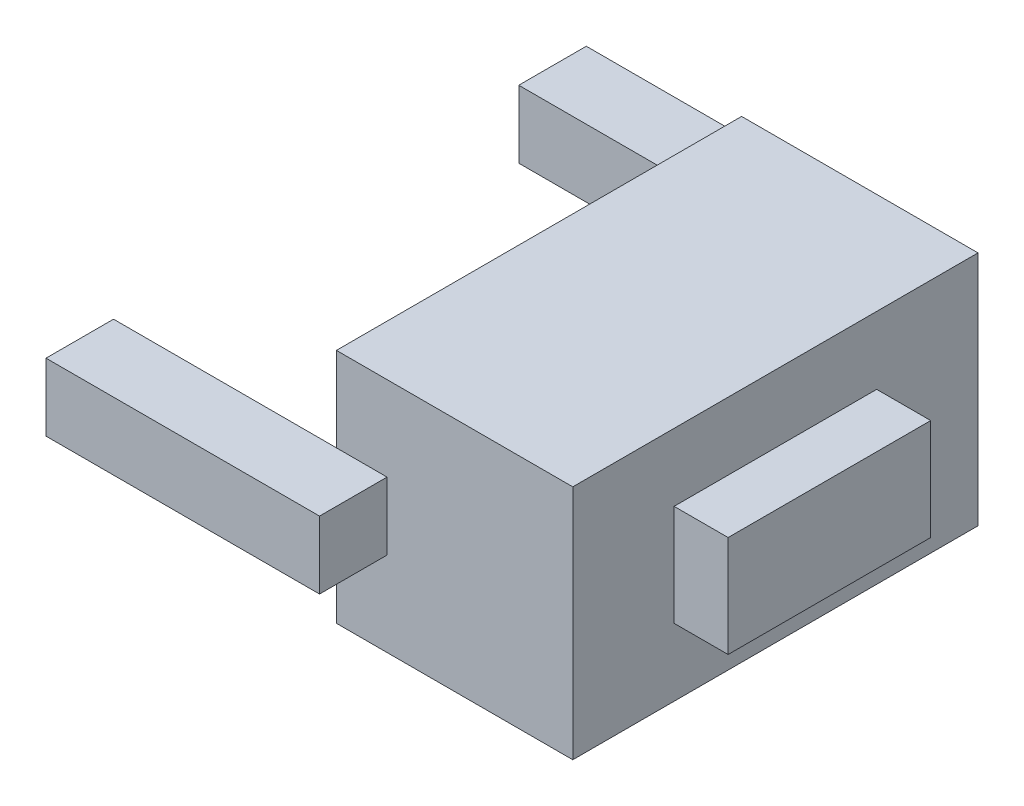
ISO-10303-21;
HEADER;
FILE_DESCRIPTION(('STEP AP214'),'2;1');
FILE_NAME('part.step','',(''),(''),'','','');
FILE_SCHEMA(('AUTOMOTIVE_DESIGN { 1 0 10303 214 1 1 1 1 }'));
ENDSEC;
DATA;
#1=APPLICATION_CONTEXT('core data for automotive mechanical design processes');
#2=APPLICATION_PROTOCOL_DEFINITION('international standard','automotive_design',2000,#1);
#3=PRODUCT_CONTEXT('',#1,'mechanical');
#4=PRODUCT('Part','Part','',(#3));
#5=PRODUCT_RELATED_PRODUCT_CATEGORY('part','',(#4));
#6=PRODUCT_DEFINITION_FORMATION('','',#4);
#7=PRODUCT_DEFINITION_CONTEXT('part definition',#1,'design');
#8=PRODUCT_DEFINITION('design','',#6,#7);
#9=PRODUCT_DEFINITION_SHAPE('','',#8);
#10=(LENGTH_UNIT() NAMED_UNIT(*) SI_UNIT(.MILLI.,.METRE.));
#11=(NAMED_UNIT(*) PLANE_ANGLE_UNIT() SI_UNIT($,.RADIAN.));
#12=(NAMED_UNIT(*) SI_UNIT($,.STERADIAN.) SOLID_ANGLE_UNIT());
#13=UNCERTAINTY_MEASURE_WITH_UNIT(LENGTH_MEASURE(1.E-05),#10,'distance_accuracy_value','');
#14=(GEOMETRIC_REPRESENTATION_CONTEXT(3) GLOBAL_UNCERTAINTY_ASSIGNED_CONTEXT((#13)) GLOBAL_UNIT_ASSIGNED_CONTEXT((#10,
#11,#12)) REPRESENTATION_CONTEXT('',''));
#15=CARTESIAN_POINT('',(0.,0.,0.));
#16=DIRECTION('',(0.,0.,1.));
#17=DIRECTION('',(1.,0.,0.));
#18=AXIS2_PLACEMENT_3D('',#15,#16,#17);
#19=CARTESIAN_POINT('',(0.,0.,0.));
#20=DIRECTION('',(-1.,0.,0.));
#21=DIRECTION('',(0.,0.,1.));
#22=AXIS2_PLACEMENT_3D('',#19,#20,#21);
#23=PLANE('',#22);
#24=DIRECTION('',(0.,1.,0.));
#25=VECTOR('',#24,1.);
#26=CARTESIAN_POINT('',(0.,0.,-6.));
#27=LINE('',#26,#25);
#28=CARTESIAN_POINT('',(0.,2.25,-6.));
#29=VERTEX_POINT('',#28);
#30=CARTESIAN_POINT('',(0.,3.5,-6.));
#31=VERTEX_POINT('',#30);
#32=EDGE_CURVE('E225',#29,#31,#27,.T.);
#33=ORIENTED_EDGE('',*,*,#32,.F.);
#34=DIRECTION('',(0.,1.,0.));
#35=VECTOR('',#34,1.);
#36=CARTESIAN_POINT('',(0.,2.25,-6.));
#37=LINE('',#36,#35);
#38=CARTESIAN_POINT('',(0.,1.25,-6.));
#39=VERTEX_POINT('',#38);
#40=EDGE_CURVE('E188',#39,#29,#37,.T.);
#41=ORIENTED_EDGE('',*,*,#40,.F.);
#42=CARTESIAN_POINT('',(0.,0.,-6.));
#43=VERTEX_POINT('',#42);
#44=EDGE_CURVE('E233',#43,#39,#27,.T.);
#45=ORIENTED_EDGE('',*,*,#44,.F.);
#46=DIRECTION('',(0.,0.,-1.));
#47=VECTOR('',#46,1.);
#48=CARTESIAN_POINT('',(0.,0.,0.));
#49=LINE('',#48,#47);
#50=CARTESIAN_POINT('',(0.,0.,0.));
#51=VERTEX_POINT('',#50);
#52=EDGE_CURVE('E234',#51,#43,#49,.T.);
#53=ORIENTED_EDGE('',*,*,#52,.F.);
#54=DIRECTION('',(0.,-1.,0.));
#55=VECTOR('',#54,1.);
#56=CARTESIAN_POINT('',(0.,0.,0.));
#57=LINE('',#56,#55);
#58=CARTESIAN_POINT('',(0.,1.25,0.));
#59=VERTEX_POINT('',#58);
#60=EDGE_CURVE('E256',#59,#51,#57,.T.);
#61=ORIENTED_EDGE('',*,*,#60,.F.);
#62=DIRECTION('',(0.,-1.,0.));
#63=VECTOR('',#62,1.);
#64=CARTESIAN_POINT('',(0.,2.25,0.));
#65=LINE('',#64,#63);
#66=CARTESIAN_POINT('',(0.,2.25,0.));
#67=VERTEX_POINT('',#66);
#68=EDGE_CURVE('E324',#67,#59,#65,.T.);
#69=ORIENTED_EDGE('',*,*,#68,.F.);
#70=CARTESIAN_POINT('',(0.,3.5,0.));
#71=VERTEX_POINT('',#70);
#72=EDGE_CURVE('E237',#71,#67,#57,.T.);
#73=ORIENTED_EDGE('',*,*,#72,.F.);
#74=DIRECTION('',(0.,0.,1.));
#75=VECTOR('',#74,1.);
#76=CARTESIAN_POINT('',(0.,3.5,0.));
#77=LINE('',#76,#75);
#78=EDGE_CURVE('E232',#31,#71,#77,.T.);
#79=ORIENTED_EDGE('',*,*,#78,.F.);
#80=EDGE_LOOP('',(#33,#41,#45,#53,#61,#69,#73,#79));
#81=FACE_BOUND('',#80,.T.);
#82=ADVANCED_FACE('F35',(#81),#23,.T.);
#83=CARTESIAN_POINT('',(3.5,0.,-6.));
#84=DIRECTION('',(0.,0.,1.));
#85=DIRECTION('',(1.,0.,0.));
#86=AXIS2_PLACEMENT_3D('',#83,#84,#85);
#87=PLANE('',#86);
#88=DIRECTION('',(-1.,0.,0.));
#89=VECTOR('',#88,1.);
#90=CARTESIAN_POINT('',(0.,1.25,-6.));
#91=LINE('',#90,#89);
#92=CARTESIAN_POINT('',(0.75,1.25,-6.));
#93=VERTEX_POINT('',#92);
#94=EDGE_CURVE('E52',#93,#39,#91,.T.);
#95=ORIENTED_EDGE('',*,*,#94,.F.);
#96=DIRECTION('',(0.,-1.,0.));
#97=VECTOR('',#96,1.);
#98=CARTESIAN_POINT('',(0.75,2.25,-6.));
#99=LINE('',#98,#97);
#100=CARTESIAN_POINT('',(0.75,2.25,-6.));
#101=VERTEX_POINT('',#100);
#102=EDGE_CURVE('E198',#101,#93,#99,.T.);
#103=ORIENTED_EDGE('',*,*,#102,.F.);
#104=DIRECTION('',(1.,0.,0.));
#105=VECTOR('',#104,1.);
#106=CARTESIAN_POINT('',(0.,2.25,-6.));
#107=LINE('',#106,#105);
#108=EDGE_CURVE('E200',#29,#101,#107,.T.);
#109=ORIENTED_EDGE('',*,*,#108,.F.);
#110=ORIENTED_EDGE('',*,*,#32,.T.);
#111=DIRECTION('',(-1.,0.,0.));
#112=VECTOR('',#111,1.);
#113=CARTESIAN_POINT('',(3.5,3.5,-6.));
#114=LINE('',#113,#112);
#115=CARTESIAN_POINT('',(3.5,3.5,-6.));
#116=VERTEX_POINT('',#115);
#117=EDGE_CURVE('E250',#116,#31,#114,.T.);
#118=ORIENTED_EDGE('',*,*,#117,.F.);
#119=DIRECTION('',(0.,1.,0.));
#120=VECTOR('',#119,1.);
#121=CARTESIAN_POINT('',(3.5,0.,-6.));
#122=LINE('',#121,#120);
#123=CARTESIAN_POINT('',(3.5,0.,-6.));
#124=VERTEX_POINT('',#123);
#125=EDGE_CURVE('E262',#124,#116,#122,.T.);
#126=ORIENTED_EDGE('',*,*,#125,.F.);
#127=DIRECTION('',(-1.,0.,0.));
#128=VECTOR('',#127,1.);
#129=CARTESIAN_POINT('',(3.5,0.,-6.));
#130=LINE('',#129,#128);
#131=EDGE_CURVE('E44',#124,#43,#130,.T.);
#132=ORIENTED_EDGE('',*,*,#131,.T.);
#133=ORIENTED_EDGE('',*,*,#44,.T.);
#134=EDGE_LOOP('',(#95,#103,#109,#110,#118,#126,#132,#133));
#135=FACE_BOUND('',#134,.T.);
#136=ADVANCED_FACE('F223',(#135),#87,.F.);
#137=CARTESIAN_POINT('',(3.5,0.,0.));
#138=DIRECTION('',(0.,0.,-1.));
#139=DIRECTION('',(-1.,0.,0.));
#140=AXIS2_PLACEMENT_3D('',#137,#138,#139);
#141=PLANE('',#140);
#142=DIRECTION('',(-1.,0.,0.));
#143=VECTOR('',#142,1.);
#144=CARTESIAN_POINT('',(0.,2.25,0.));
#145=LINE('',#144,#143);
#146=CARTESIAN_POINT('',(0.75,2.25,0.));
#147=VERTEX_POINT('',#146);
#148=EDGE_CURVE('E60',#147,#67,#145,.T.);
#149=ORIENTED_EDGE('',*,*,#148,.F.);
#150=DIRECTION('',(0.,1.,0.));
#151=VECTOR('',#150,1.);
#152=CARTESIAN_POINT('',(0.75,2.25,0.));
#153=LINE('',#152,#151);
#154=CARTESIAN_POINT('',(0.75,1.25,0.));
#155=VERTEX_POINT('',#154);
#156=EDGE_CURVE('E310',#155,#147,#153,.T.);
#157=ORIENTED_EDGE('',*,*,#156,.F.);
#158=DIRECTION('',(1.,0.,0.));
#159=VECTOR('',#158,1.);
#160=CARTESIAN_POINT('',(0.,1.25,0.));
#161=LINE('',#160,#159);
#162=EDGE_CURVE('E320',#59,#155,#161,.T.);
#163=ORIENTED_EDGE('',*,*,#162,.F.);
#164=ORIENTED_EDGE('',*,*,#60,.T.);
#165=DIRECTION('',(-1.,0.,0.));
#166=VECTOR('',#165,1.);
#167=CARTESIAN_POINT('',(3.5,0.,0.));
#168=LINE('',#167,#166);
#169=CARTESIAN_POINT('',(3.5,0.,0.));
#170=VERTEX_POINT('',#169);
#171=EDGE_CURVE('E11',#170,#51,#168,.T.);
#172=ORIENTED_EDGE('',*,*,#171,.F.);
#173=DIRECTION('',(0.,-1.,0.));
#174=VECTOR('',#173,1.);
#175=CARTESIAN_POINT('',(3.5,0.,0.));
#176=LINE('',#175,#174);
#177=CARTESIAN_POINT('',(3.5,3.5,0.));
#178=VERTEX_POINT('',#177);
#179=EDGE_CURVE('E246',#178,#170,#176,.T.);
#180=ORIENTED_EDGE('',*,*,#179,.F.);
#181=DIRECTION('',(-1.,0.,0.));
#182=VECTOR('',#181,1.);
#183=CARTESIAN_POINT('',(3.5,3.5,0.));
#184=LINE('',#183,#182);
#185=EDGE_CURVE('E247',#178,#71,#184,.T.);
#186=ORIENTED_EDGE('',*,*,#185,.T.);
#187=ORIENTED_EDGE('',*,*,#72,.T.);
#188=EDGE_LOOP('',(#149,#157,#163,#164,#172,#180,#186,#187));
#189=FACE_BOUND('',#188,.T.);
#190=ADVANCED_FACE('F37',(#189),#141,.F.);
#191=CARTESIAN_POINT('',(3.5,0.,0.));
#192=DIRECTION('',(-1.,0.,0.));
#193=DIRECTION('',(0.,0.,1.));
#194=AXIS2_PLACEMENT_3D('',#191,#192,#193);
#195=PLANE('',#194);
#196=ORIENTED_EDGE('',*,*,#179,.T.);
#197=DIRECTION('',(0.,0.,-1.));
#198=VECTOR('',#197,1.);
#199=CARTESIAN_POINT('',(3.5,0.,0.));
#200=LINE('',#199,#198);
#201=EDGE_CURVE('E264',#170,#124,#200,.T.);
#202=ORIENTED_EDGE('',*,*,#201,.T.);
#203=ORIENTED_EDGE('',*,*,#125,.T.);
#204=DIRECTION('',(0.,0.,1.));
#205=VECTOR('',#204,1.);
#206=CARTESIAN_POINT('',(3.5,3.5,0.));
#207=LINE('',#206,#205);
#208=EDGE_CURVE('E251',#116,#178,#207,.T.);
#209=ORIENTED_EDGE('',*,*,#208,.T.);
#210=EDGE_LOOP('',(#196,#202,#203,#209));
#211=FACE_BOUND('',#210,.T.);
#212=DIRECTION('',(0.,-1.,0.));
#213=VECTOR('',#212,1.);
#214=CARTESIAN_POINT('',(3.5,1.,-1.5));
#215=LINE('',#214,#213);
#216=CARTESIAN_POINT('',(3.5,2.5,-1.5));
#217=VERTEX_POINT('',#216);
#218=CARTESIAN_POINT('',(3.5,1.,-1.5));
#219=VERTEX_POINT('',#218);
#220=EDGE_CURVE('E291',#217,#219,#215,.T.);
#221=ORIENTED_EDGE('',*,*,#220,.F.);
#222=DIRECTION('',(0.,0.,1.));
#223=VECTOR('',#222,1.);
#224=CARTESIAN_POINT('',(3.5,2.5,-1.5));
#225=LINE('',#224,#223);
#226=CARTESIAN_POINT('',(3.5,2.5,-4.5));
#227=VERTEX_POINT('',#226);
#228=EDGE_CURVE('E281',#227,#217,#225,.T.);
#229=ORIENTED_EDGE('',*,*,#228,.F.);
#230=DIRECTION('',(0.,1.,0.));
#231=VECTOR('',#230,1.);
#232=CARTESIAN_POINT('',(3.5,1.,-4.5));
#233=LINE('',#232,#231);
#234=CARTESIAN_POINT('',(3.5,1.,-4.5));
#235=VERTEX_POINT('',#234);
#236=EDGE_CURVE('E285',#235,#227,#233,.T.);
#237=ORIENTED_EDGE('',*,*,#236,.F.);
#238=DIRECTION('',(0.,0.,-1.));
#239=VECTOR('',#238,1.);
#240=CARTESIAN_POINT('',(3.5,1.,-1.5));
#241=LINE('',#240,#239);
#242=EDGE_CURVE('E288',#219,#235,#241,.T.);
#243=ORIENTED_EDGE('',*,*,#242,.F.);
#244=EDGE_LOOP('',(#221,#229,#237,#243));
#245=FACE_BOUND('',#244,.T.);
#246=ADVANCED_FACE('F379',(#211,#245),#195,.F.);
#247=CARTESIAN_POINT('',(3.5,0.,0.));
#248=DIRECTION('',(0.,1.,0.));
#249=DIRECTION('',(0.,0.,1.));
#250=AXIS2_PLACEMENT_3D('',#247,#248,#249);
#251=PLANE('',#250);
#252=ORIENTED_EDGE('',*,*,#52,.T.);
#253=ORIENTED_EDGE('',*,*,#131,.F.);
#254=ORIENTED_EDGE('',*,*,#201,.F.);
#255=ORIENTED_EDGE('',*,*,#171,.T.);
#256=EDGE_LOOP('',(#252,#253,#254,#255));
#257=FACE_BOUND('',#256,.T.);
#258=ADVANCED_FACE('F384',(#257),#251,.F.);
#259=CARTESIAN_POINT('',(3.5,3.5,0.));
#260=DIRECTION('',(0.,-1.,0.));
#261=DIRECTION('',(0.,0.,-1.));
#262=AXIS2_PLACEMENT_3D('',#259,#260,#261);
#263=PLANE('',#262);
#264=ORIENTED_EDGE('',*,*,#78,.T.);
#265=ORIENTED_EDGE('',*,*,#185,.F.);
#266=ORIENTED_EDGE('',*,*,#208,.F.);
#267=ORIENTED_EDGE('',*,*,#117,.T.);
#268=EDGE_LOOP('',(#264,#265,#266,#267));
#269=FACE_BOUND('',#268,.T.);
#270=ADVANCED_FACE('F381',(#269),#263,.F.);
#271=CARTESIAN_POINT('',(4.3,1.,-1.5));
#272=DIRECTION('',(0.,0.,-1.));
#273=DIRECTION('',(-1.,0.,0.));
#274=AXIS2_PLACEMENT_3D('',#271,#272,#273);
#275=PLANE('',#274);
#276=ORIENTED_EDGE('',*,*,#220,.T.);
#277=DIRECTION('',(-1.,0.,0.));
#278=VECTOR('',#277,1.);
#279=CARTESIAN_POINT('',(4.3,1.,-1.5));
#280=LINE('',#279,#278);
#281=CARTESIAN_POINT('',(4.3,1.,-1.5));
#282=VERTEX_POINT('',#281);
#283=EDGE_CURVE('E268',#282,#219,#280,.T.);
#284=ORIENTED_EDGE('',*,*,#283,.F.);
#285=DIRECTION('',(0.,-1.,0.));
#286=VECTOR('',#285,1.);
#287=CARTESIAN_POINT('',(4.3,1.,-1.5));
#288=LINE('',#287,#286);
#289=CARTESIAN_POINT('',(4.3,2.5,-1.5));
#290=VERTEX_POINT('',#289);
#291=EDGE_CURVE('E284',#290,#282,#288,.T.);
#292=ORIENTED_EDGE('',*,*,#291,.F.);
#293=DIRECTION('',(-1.,0.,0.));
#294=VECTOR('',#293,1.);
#295=CARTESIAN_POINT('',(4.3,2.5,-1.5));
#296=LINE('',#295,#294);
#297=EDGE_CURVE('E277',#290,#217,#296,.T.);
#298=ORIENTED_EDGE('',*,*,#297,.T.);
#299=EDGE_LOOP('',(#276,#284,#292,#298));
#300=FACE_BOUND('',#299,.T.);
#301=ADVANCED_FACE('F383',(#300),#275,.F.);
#302=CARTESIAN_POINT('',(4.3,1.,-1.5));
#303=DIRECTION('',(0.,1.,0.));
#304=DIRECTION('',(0.,0.,1.));
#305=AXIS2_PLACEMENT_3D('',#302,#303,#304);
#306=PLANE('',#305);
#307=ORIENTED_EDGE('',*,*,#242,.T.);
#308=DIRECTION('',(-1.,0.,0.));
#309=VECTOR('',#308,1.);
#310=CARTESIAN_POINT('',(4.3,1.,-4.5));
#311=LINE('',#310,#309);
#312=CARTESIAN_POINT('',(4.3,1.,-4.5));
#313=VERTEX_POINT('',#312);
#314=EDGE_CURVE('E271',#313,#235,#311,.T.);
#315=ORIENTED_EDGE('',*,*,#314,.F.);
#316=DIRECTION('',(0.,0.,-1.));
#317=VECTOR('',#316,1.);
#318=CARTESIAN_POINT('',(4.3,1.,-1.5));
#319=LINE('',#318,#317);
#320=EDGE_CURVE('E298',#282,#313,#319,.T.);
#321=ORIENTED_EDGE('',*,*,#320,.F.);
#322=ORIENTED_EDGE('',*,*,#283,.T.);
#323=EDGE_LOOP('',(#307,#315,#321,#322));
#324=FACE_BOUND('',#323,.T.);
#325=ADVANCED_FACE('F426',(#324),#306,.F.);
#326=CARTESIAN_POINT('',(4.3,1.,-4.5));
#327=DIRECTION('',(0.,0.,1.));
#328=DIRECTION('',(1.,0.,0.));
#329=AXIS2_PLACEMENT_3D('',#326,#327,#328);
#330=PLANE('',#329);
#331=ORIENTED_EDGE('',*,*,#236,.T.);
#332=DIRECTION('',(-1.,0.,0.));
#333=VECTOR('',#332,1.);
#334=CARTESIAN_POINT('',(4.3,2.5,-4.5));
#335=LINE('',#334,#333);
#336=CARTESIAN_POINT('',(4.3,2.5,-4.5));
#337=VERTEX_POINT('',#336);
#338=EDGE_CURVE('E274',#337,#227,#335,.T.);
#339=ORIENTED_EDGE('',*,*,#338,.F.);
#340=DIRECTION('',(0.,1.,0.));
#341=VECTOR('',#340,1.);
#342=CARTESIAN_POINT('',(4.3,1.,-4.5));
#343=LINE('',#342,#341);
#344=EDGE_CURVE('E296',#313,#337,#343,.T.);
#345=ORIENTED_EDGE('',*,*,#344,.F.);
#346=ORIENTED_EDGE('',*,*,#314,.T.);
#347=EDGE_LOOP('',(#331,#339,#345,#346));
#348=FACE_BOUND('',#347,.T.);
#349=ADVANCED_FACE('F422',(#348),#330,.F.);
#350=CARTESIAN_POINT('',(4.3,2.5,-1.5));
#351=DIRECTION('',(0.,-1.,0.));
#352=DIRECTION('',(0.,0.,-1.));
#353=AXIS2_PLACEMENT_3D('',#350,#351,#352);
#354=PLANE('',#353);
#355=ORIENTED_EDGE('',*,*,#228,.T.);
#356=ORIENTED_EDGE('',*,*,#297,.F.);
#357=DIRECTION('',(0.,0.,1.));
#358=VECTOR('',#357,1.);
#359=CARTESIAN_POINT('',(4.3,2.5,-1.5));
#360=LINE('',#359,#358);
#361=EDGE_CURVE('E280',#337,#290,#360,.T.);
#362=ORIENTED_EDGE('',*,*,#361,.F.);
#363=ORIENTED_EDGE('',*,*,#338,.T.);
#364=EDGE_LOOP('',(#355,#356,#362,#363));
#365=FACE_BOUND('',#364,.T.);
#366=ADVANCED_FACE('F415',(#365),#354,.F.);
#367=CARTESIAN_POINT('',(4.3,0.,0.));
#368=DIRECTION('',(-1.,0.,0.));
#369=DIRECTION('',(0.,0.,1.));
#370=AXIS2_PLACEMENT_3D('',#367,#368,#369);
#371=PLANE('',#370);
#372=ORIENTED_EDGE('',*,*,#291,.T.);
#373=ORIENTED_EDGE('',*,*,#320,.T.);
#374=ORIENTED_EDGE('',*,*,#344,.T.);
#375=ORIENTED_EDGE('',*,*,#361,.T.);
#376=EDGE_LOOP('',(#372,#373,#374,#375));
#377=FACE_BOUND('',#376,.T.);
#378=ADVANCED_FACE('F408',(#377),#371,.F.);
#379=CARTESIAN_POINT('',(0.,1.25,1.));
#380=DIRECTION('',(0.,1.,0.));
#381=DIRECTION('',(0.,0.,1.));
#382=AXIS2_PLACEMENT_3D('',#379,#380,#381);
#383=PLANE('',#382);
#384=ORIENTED_EDGE('',*,*,#162,.T.);
#385=DIRECTION('',(0.,0.,-1.));
#386=VECTOR('',#385,1.);
#387=CARTESIAN_POINT('',(0.75,1.25,1.));
#388=LINE('',#387,#386);
#389=CARTESIAN_POINT('',(0.75,1.25,1.));
#390=VERTEX_POINT('',#389);
#391=EDGE_CURVE('E294',#390,#155,#388,.T.);
#392=ORIENTED_EDGE('',*,*,#391,.F.);
#393=DIRECTION('',(1.,0.,0.));
#394=VECTOR('',#393,1.);
#395=CARTESIAN_POINT('',(0.,1.25,1.));
#396=LINE('',#395,#394);
#397=CARTESIAN_POINT('',(-3.3,1.25,1.));
#398=VERTEX_POINT('',#397);
#399=EDGE_CURVE('E315',#398,#390,#396,.T.);
#400=ORIENTED_EDGE('',*,*,#399,.F.);
#401=DIRECTION('',(0.,0.,1.));
#402=VECTOR('',#401,1.);
#403=CARTESIAN_POINT('',(-3.3,1.25,0.));
#404=LINE('',#403,#402);
#405=CARTESIAN_POINT('',(-3.3,1.25,0.));
#406=VERTEX_POINT('',#405);
#407=EDGE_CURVE('E352',#406,#398,#404,.T.);
#408=ORIENTED_EDGE('',*,*,#407,.F.);
#409=DIRECTION('',(1.,0.,0.));
#410=VECTOR('',#409,1.);
#411=CARTESIAN_POINT('',(-3.3,1.25,0.));
#412=LINE('',#411,#410);
#413=EDGE_CURVE('E317',#406,#59,#412,.T.);
#414=ORIENTED_EDGE('',*,*,#413,.T.);
#415=EDGE_LOOP('',(#384,#392,#400,#408,#414));
#416=FACE_BOUND('',#415,.T.);
#417=ADVANCED_FACE('F406',(#416),#383,.F.);
#418=CARTESIAN_POINT('',(0.75,2.25,1.));
#419=DIRECTION('',(-1.,0.,0.));
#420=DIRECTION('',(0.,-1.,0.));
#421=AXIS2_PLACEMENT_3D('',#418,#419,#420);
#422=PLANE('',#421);
#423=ORIENTED_EDGE('',*,*,#156,.T.);
#424=DIRECTION('',(0.,0.,-1.));
#425=VECTOR('',#424,1.);
#426=CARTESIAN_POINT('',(0.75,2.25,1.));
#427=LINE('',#426,#425);
#428=CARTESIAN_POINT('',(0.75,2.25,1.));
#429=VERTEX_POINT('',#428);
#430=EDGE_CURVE('E304',#429,#147,#427,.T.);
#431=ORIENTED_EDGE('',*,*,#430,.F.);
#432=DIRECTION('',(0.,1.,0.));
#433=VECTOR('',#432,1.);
#434=CARTESIAN_POINT('',(0.75,2.25,1.));
#435=LINE('',#434,#433);
#436=EDGE_CURVE('E336',#390,#429,#435,.T.);
#437=ORIENTED_EDGE('',*,*,#436,.F.);
#438=ORIENTED_EDGE('',*,*,#391,.T.);
#439=EDGE_LOOP('',(#423,#431,#437,#438));
#440=FACE_BOUND('',#439,.T.);
#441=ADVANCED_FACE('F403',(#440),#422,.F.);
#442=CARTESIAN_POINT('',(0.,2.25,1.));
#443=DIRECTION('',(0.,-1.,0.));
#444=DIRECTION('',(0.,0.,-1.));
#445=AXIS2_PLACEMENT_3D('',#442,#443,#444);
#446=PLANE('',#445);
#447=ORIENTED_EDGE('',*,*,#148,.T.);
#448=DIRECTION('',(1.,0.,0.));
#449=VECTOR('',#448,1.);
#450=CARTESIAN_POINT('',(-3.3,2.25,0.));
#451=LINE('',#450,#449);
#452=CARTESIAN_POINT('',(-3.3,2.25,0.));
#453=VERTEX_POINT('',#452);
#454=EDGE_CURVE('E321',#453,#67,#451,.T.);
#455=ORIENTED_EDGE('',*,*,#454,.F.);
#456=DIRECTION('',(0.,0.,-1.));
#457=VECTOR('',#456,1.);
#458=CARTESIAN_POINT('',(-3.3,2.25,0.));
#459=LINE('',#458,#457);
#460=CARTESIAN_POINT('',(-3.3,2.25,1.));
#461=VERTEX_POINT('',#460);
#462=EDGE_CURVE('E333',#461,#453,#459,.T.);
#463=ORIENTED_EDGE('',*,*,#462,.F.);
#464=DIRECTION('',(-1.,0.,0.));
#465=VECTOR('',#464,1.);
#466=CARTESIAN_POINT('',(0.,2.25,1.));
#467=LINE('',#466,#465);
#468=EDGE_CURVE('E307',#429,#461,#467,.T.);
#469=ORIENTED_EDGE('',*,*,#468,.F.);
#470=ORIENTED_EDGE('',*,*,#430,.T.);
#471=EDGE_LOOP('',(#447,#455,#463,#469,#470));
#472=FACE_BOUND('',#471,.T.);
#473=ADVANCED_FACE('F353',(#472),#446,.F.);
#474=CARTESIAN_POINT('',(0.,0.,1.));
#475=DIRECTION('',(0.,0.,1.));
#476=DIRECTION('',(1.,0.,0.));
#477=AXIS2_PLACEMENT_3D('',#474,#475,#476);
#478=PLANE('',#477);
#479=ORIENTED_EDGE('',*,*,#468,.T.);
#480=DIRECTION('',(0.,1.,0.));
#481=VECTOR('',#480,1.);
#482=CARTESIAN_POINT('',(-3.3,2.25,1.));
#483=LINE('',#482,#481);
#484=EDGE_CURVE('E342',#398,#461,#483,.T.);
#485=ORIENTED_EDGE('',*,*,#484,.F.);
#486=ORIENTED_EDGE('',*,*,#399,.T.);
#487=ORIENTED_EDGE('',*,*,#436,.T.);
#488=EDGE_LOOP('',(#479,#485,#486,#487));
#489=FACE_BOUND('',#488,.T.);
#490=ADVANCED_FACE('F341',(#489),#478,.T.);
#491=CARTESIAN_POINT('',(-3.3,2.25,0.));
#492=DIRECTION('',(0.,0.,1.));
#493=DIRECTION('',(1.,0.,0.));
#494=AXIS2_PLACEMENT_3D('',#491,#492,#493);
#495=PLANE('',#494);
#496=ORIENTED_EDGE('',*,*,#68,.T.);
#497=ORIENTED_EDGE('',*,*,#413,.F.);
#498=DIRECTION('',(0.,-1.,0.));
#499=VECTOR('',#498,1.);
#500=CARTESIAN_POINT('',(-3.3,2.25,0.));
#501=LINE('',#500,#499);
#502=EDGE_CURVE('E328',#453,#406,#501,.T.);
#503=ORIENTED_EDGE('',*,*,#502,.F.);
#504=ORIENTED_EDGE('',*,*,#454,.T.);
#505=EDGE_LOOP('',(#496,#497,#503,#504));
#506=FACE_BOUND('',#505,.T.);
#507=ADVANCED_FACE('F357',(#506),#495,.F.);
#508=CARTESIAN_POINT('',(-3.3,0.,0.));
#509=DIRECTION('',(-1.,0.,0.));
#510=DIRECTION('',(0.,0.,1.));
#511=AXIS2_PLACEMENT_3D('',#508,#509,#510);
#512=PLANE('',#511);
#513=ORIENTED_EDGE('',*,*,#502,.T.);
#514=ORIENTED_EDGE('',*,*,#407,.T.);
#515=ORIENTED_EDGE('',*,*,#484,.T.);
#516=ORIENTED_EDGE('',*,*,#462,.T.);
#517=EDGE_LOOP('',(#513,#514,#515,#516));
#518=FACE_BOUND('',#517,.T.);
#519=ADVANCED_FACE('F350',(#518),#512,.T.);
#520=CARTESIAN_POINT('',(0.,2.25,-7.));
#521=DIRECTION('',(0.,-1.,0.));
#522=DIRECTION('',(0.,0.,-1.));
#523=AXIS2_PLACEMENT_3D('',#520,#521,#522);
#524=PLANE('',#523);
#525=ORIENTED_EDGE('',*,*,#108,.T.);
#526=DIRECTION('',(0.,0.,1.));
#527=VECTOR('',#526,1.);
#528=CARTESIAN_POINT('',(0.75,2.25,-7.));
#529=LINE('',#528,#527);
#530=CARTESIAN_POINT('',(0.75,2.25,-7.));
#531=VERTEX_POINT('',#530);
#532=EDGE_CURVE('E329',#531,#101,#529,.T.);
#533=ORIENTED_EDGE('',*,*,#532,.F.);
#534=DIRECTION('',(1.,0.,0.));
#535=VECTOR('',#534,1.);
#536=CARTESIAN_POINT('',(0.,2.25,-7.));
#537=LINE('',#536,#535);
#538=CARTESIAN_POINT('',(-3.3,2.25,-7.));
#539=VERTEX_POINT('',#538);
#540=EDGE_CURVE('E195',#539,#531,#537,.T.);
#541=ORIENTED_EDGE('',*,*,#540,.F.);
#542=DIRECTION('',(0.,0.,-1.));
#543=VECTOR('',#542,1.);
#544=CARTESIAN_POINT('',(-3.3,2.25,-7.));
#545=LINE('',#544,#543);
#546=CARTESIAN_POINT('',(-3.3,2.25,-6.));
#547=VERTEX_POINT('',#546);
#548=EDGE_CURVE('E187',#547,#539,#545,.T.);
#549=ORIENTED_EDGE('',*,*,#548,.F.);
#550=DIRECTION('',(1.,0.,0.));
#551=VECTOR('',#550,1.);
#552=CARTESIAN_POINT('',(-3.3,2.25,-6.));
#553=LINE('',#552,#551);
#554=EDGE_CURVE('E194',#547,#29,#553,.T.);
#555=ORIENTED_EDGE('',*,*,#554,.T.);
#556=EDGE_LOOP('',(#525,#533,#541,#549,#555));
#557=FACE_BOUND('',#556,.T.);
#558=ADVANCED_FACE('F218',(#557),#524,.F.);
#559=CARTESIAN_POINT('',(0.75,2.25,-7.));
#560=DIRECTION('',(-1.,0.,0.));
#561=DIRECTION('',(0.,0.,1.));
#562=AXIS2_PLACEMENT_3D('',#559,#560,#561);
#563=PLANE('',#562);
#564=ORIENTED_EDGE('',*,*,#102,.T.);
#565=DIRECTION('',(0.,0.,1.));
#566=VECTOR('',#565,1.);
#567=CARTESIAN_POINT('',(0.75,1.25,-7.));
#568=LINE('',#567,#566);
#569=CARTESIAN_POINT('',(0.75,1.25,-7.));
#570=VERTEX_POINT('',#569);
#571=EDGE_CURVE('E174',#570,#93,#568,.T.);
#572=ORIENTED_EDGE('',*,*,#571,.F.);
#573=DIRECTION('',(0.,-1.,0.));
#574=VECTOR('',#573,1.);
#575=CARTESIAN_POINT('',(0.75,2.25,-7.));
#576=LINE('',#575,#574);
#577=EDGE_CURVE('E170',#531,#570,#576,.T.);
#578=ORIENTED_EDGE('',*,*,#577,.F.);
#579=ORIENTED_EDGE('',*,*,#532,.T.);
#580=EDGE_LOOP('',(#564,#572,#578,#579));
#581=FACE_BOUND('',#580,.T.);
#582=ADVANCED_FACE('F362',(#581),#563,.F.);
#583=CARTESIAN_POINT('',(0.,1.25,-7.));
#584=DIRECTION('',(0.,1.,0.));
#585=DIRECTION('',(0.,0.,1.));
#586=AXIS2_PLACEMENT_3D('',#583,#584,#585);
#587=PLANE('',#586);
#588=ORIENTED_EDGE('',*,*,#94,.T.);
#589=DIRECTION('',(1.,0.,0.));
#590=VECTOR('',#589,1.);
#591=CARTESIAN_POINT('',(-3.3,1.25,-6.));
#592=LINE('',#591,#590);
#593=CARTESIAN_POINT('',(-3.3,1.25,-6.));
#594=VERTEX_POINT('',#593);
#595=EDGE_CURVE('E179',#594,#39,#592,.T.);
#596=ORIENTED_EDGE('',*,*,#595,.F.);
#597=DIRECTION('',(0.,0.,1.));
#598=VECTOR('',#597,1.);
#599=CARTESIAN_POINT('',(-3.3,1.25,-7.));
#600=LINE('',#599,#598);
#601=CARTESIAN_POINT('',(-3.3,1.25,-7.));
#602=VERTEX_POINT('',#601);
#603=EDGE_CURVE('E177',#602,#594,#600,.T.);
#604=ORIENTED_EDGE('',*,*,#603,.F.);
#605=DIRECTION('',(-1.,0.,0.));
#606=VECTOR('',#605,1.);
#607=CARTESIAN_POINT('',(0.,1.25,-7.));
#608=LINE('',#607,#606);
#609=EDGE_CURVE('E164',#570,#602,#608,.T.);
#610=ORIENTED_EDGE('',*,*,#609,.F.);
#611=ORIENTED_EDGE('',*,*,#571,.T.);
#612=EDGE_LOOP('',(#588,#596,#604,#610,#611));
#613=FACE_BOUND('',#612,.T.);
#614=ADVANCED_FACE('F178',(#613),#587,.F.);
#615=CARTESIAN_POINT('',(0.,0.,-7.));
#616=DIRECTION('',(0.,0.,1.));
#617=DIRECTION('',(1.,0.,0.));
#618=AXIS2_PLACEMENT_3D('',#615,#616,#617);
#619=PLANE('',#618);
#620=ORIENTED_EDGE('',*,*,#609,.T.);
#621=DIRECTION('',(0.,-1.,0.));
#622=VECTOR('',#621,1.);
#623=CARTESIAN_POINT('',(-3.3,2.25,-7.));
#624=LINE('',#623,#622);
#625=EDGE_CURVE('E168',#539,#602,#624,.T.);
#626=ORIENTED_EDGE('',*,*,#625,.F.);
#627=ORIENTED_EDGE('',*,*,#540,.T.);
#628=ORIENTED_EDGE('',*,*,#577,.T.);
#629=EDGE_LOOP('',(#620,#626,#627,#628));
#630=FACE_BOUND('',#629,.T.);
#631=ADVANCED_FACE('F166',(#630),#619,.F.);
#632=CARTESIAN_POINT('',(-3.3,2.25,-6.));
#633=DIRECTION('',(0.,0.,-1.));
#634=DIRECTION('',(-1.,0.,0.));
#635=AXIS2_PLACEMENT_3D('',#632,#633,#634);
#636=PLANE('',#635);
#637=ORIENTED_EDGE('',*,*,#40,.T.);
#638=ORIENTED_EDGE('',*,*,#554,.F.);
#639=DIRECTION('',(0.,1.,0.));
#640=VECTOR('',#639,1.);
#641=CARTESIAN_POINT('',(-3.3,2.25,-6.));
#642=LINE('',#641,#640);
#643=EDGE_CURVE('E182',#594,#547,#642,.T.);
#644=ORIENTED_EDGE('',*,*,#643,.F.);
#645=ORIENTED_EDGE('',*,*,#595,.T.);
#646=EDGE_LOOP('',(#637,#638,#644,#645));
#647=FACE_BOUND('',#646,.T.);
#648=ADVANCED_FACE('F501',(#647),#636,.F.);
#649=CARTESIAN_POINT('',(-3.3,0.,0.));
#650=DIRECTION('',(-1.,0.,0.));
#651=DIRECTION('',(0.,0.,1.));
#652=AXIS2_PLACEMENT_3D('',#649,#650,#651);
#653=PLANE('',#652);
#654=ORIENTED_EDGE('',*,*,#625,.T.);
#655=ORIENTED_EDGE('',*,*,#603,.T.);
#656=ORIENTED_EDGE('',*,*,#643,.T.);
#657=ORIENTED_EDGE('',*,*,#548,.T.);
#658=EDGE_LOOP('',(#654,#655,#656,#657));
#659=FACE_BOUND('',#658,.T.);
#660=ADVANCED_FACE('F185',(#659),#653,.T.);
#661=CLOSED_SHELL('',(#82,#136,#190,#246,#258,#270,#301,#325,#349,#366,#378,#417,#441,#473,#490,
#507,#519,#558,#582,#614,#631,#648,#660));
#662=MANIFOLD_SOLID_BREP('B2',#661);
#663=ADVANCED_BREP_SHAPE_REPRESENTATION('',(#18,#662),#14);
#664=SHAPE_DEFINITION_REPRESENTATION(#9,#663);
ENDSEC;
END-ISO-10303-21;
